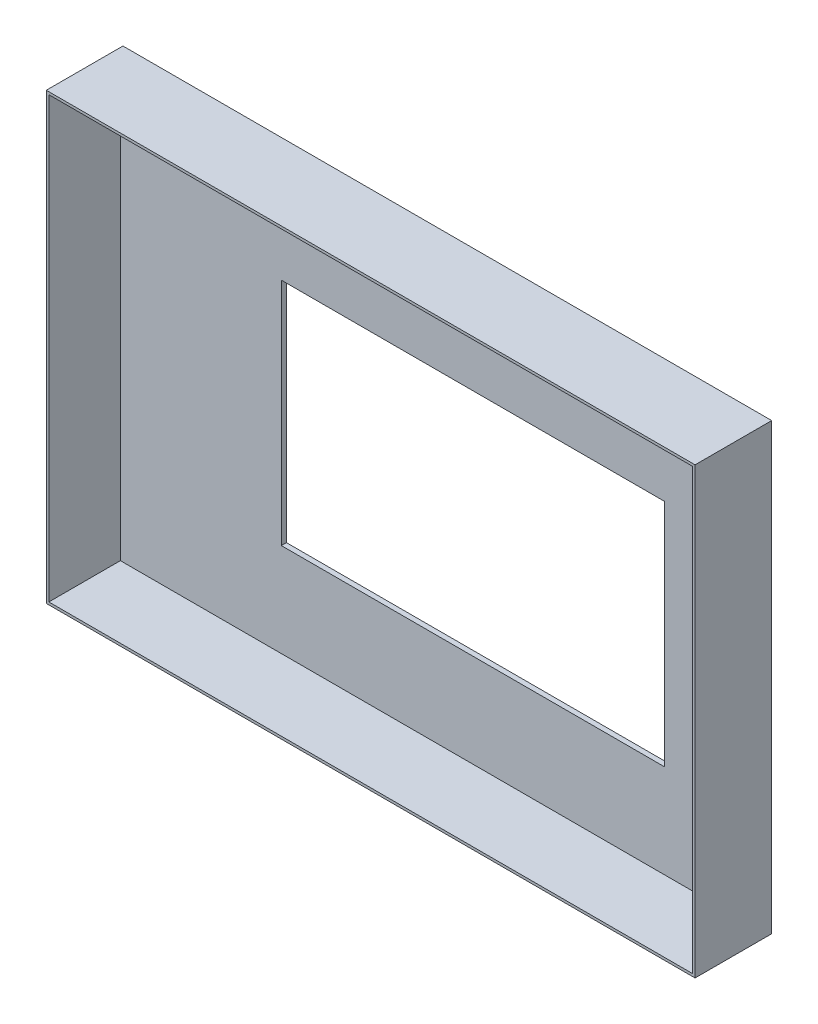
ISO-10303-21;
HEADER;
FILE_DESCRIPTION(('STEP AP214'),'2;1');
FILE_NAME('part.step','',(''),(''),'','','');
FILE_SCHEMA(('AUTOMOTIVE_DESIGN { 1 0 10303 214 1 1 1 1 }'));
ENDSEC;
DATA;
#1=APPLICATION_CONTEXT('core data for automotive mechanical design processes');
#2=APPLICATION_PROTOCOL_DEFINITION('international standard','automotive_design',2000,#1);
#3=PRODUCT_CONTEXT('',#1,'mechanical');
#4=PRODUCT('Part','Part','',(#3));
#5=PRODUCT_RELATED_PRODUCT_CATEGORY('part','',(#4));
#6=PRODUCT_DEFINITION_FORMATION('','',#4);
#7=PRODUCT_DEFINITION_CONTEXT('part definition',#1,'design');
#8=PRODUCT_DEFINITION('design','',#6,#7);
#9=PRODUCT_DEFINITION_SHAPE('','',#8);
#10=(LENGTH_UNIT() NAMED_UNIT(*) SI_UNIT(.MILLI.,.METRE.));
#11=(NAMED_UNIT(*) PLANE_ANGLE_UNIT() SI_UNIT($,.RADIAN.));
#12=(NAMED_UNIT(*) SI_UNIT($,.STERADIAN.) SOLID_ANGLE_UNIT());
#13=UNCERTAINTY_MEASURE_WITH_UNIT(LENGTH_MEASURE(1.E-05),#10,'distance_accuracy_value','');
#14=(GEOMETRIC_REPRESENTATION_CONTEXT(3) GLOBAL_UNCERTAINTY_ASSIGNED_CONTEXT((#13)) GLOBAL_UNIT_ASSIGNED_CONTEXT((#10,
#11,#12)) REPRESENTATION_CONTEXT('',''));
#15=CARTESIAN_POINT('',(0.,0.,0.));
#16=DIRECTION('',(0.,0.,1.));
#17=DIRECTION('',(1.,0.,0.));
#18=AXIS2_PLACEMENT_3D('',#15,#16,#17);
#19=CARTESIAN_POINT('',(0.,0.,0.999999999999999));
#20=DIRECTION('',(0.,0.,1.));
#21=DIRECTION('',(1.,0.,0.));
#22=AXIS2_PLACEMENT_3D('',#19,#20,#21);
#23=PLANE('',#22);
#24=DIRECTION('',(0.,-1.,0.));
#25=VECTOR('',#24,1.);
#26=CARTESIAN_POINT('',(-61.095,26.805,0.999999999999999));
#27=LINE('',#26,#25);
#28=CARTESIAN_POINT('',(-61.095,26.805,0.999999999999999));
#29=VERTEX_POINT('',#28);
#30=CARTESIAN_POINT('',(-61.095,-59.195,0.999999999999999));
#31=VERTEX_POINT('',#30);
#32=EDGE_CURVE('E163',#29,#31,#27,.T.);
#33=ORIENTED_EDGE('',*,*,#32,.T.);
#34=DIRECTION('',(1.,0.,0.));
#35=VECTOR('',#34,1.);
#36=CARTESIAN_POINT('',(-61.095,-59.195,0.999999999999999));
#37=LINE('',#36,#35);
#38=CARTESIAN_POINT('',(64.905,-59.195,0.999999999999999));
#39=VERTEX_POINT('',#38);
#40=EDGE_CURVE('E166',#31,#39,#37,.T.);
#41=ORIENTED_EDGE('',*,*,#40,.T.);
#42=DIRECTION('',(0.,1.,0.));
#43=VECTOR('',#42,1.);
#44=CARTESIAN_POINT('',(64.905,26.805,0.999999999999999));
#45=LINE('',#44,#43);
#46=CARTESIAN_POINT('',(64.905,26.805,0.999999999999999));
#47=VERTEX_POINT('',#46);
#48=EDGE_CURVE('E170',#39,#47,#45,.T.);
#49=ORIENTED_EDGE('',*,*,#48,.T.);
#50=DIRECTION('',(-1.,0.,0.));
#51=VECTOR('',#50,1.);
#52=CARTESIAN_POINT('',(-61.095,26.805,0.999999999999999));
#53=LINE('',#52,#51);
#54=EDGE_CURVE('E173',#47,#29,#53,.T.);
#55=ORIENTED_EDGE('',*,*,#54,.T.);
#56=EDGE_LOOP('',(#33,#41,#49,#55));
#57=FACE_BOUND('',#56,.T.);
#58=DIRECTION('',(1.,0.,0.));
#59=VECTOR('',#58,1.);
#60=CARTESIAN_POINT('',(45.405,4.11652592288495,1.));
#61=LINE('',#60,#59);
#62=CARTESIAN_POINT('',(-29.595,4.11652592288495,1.));
#63=VERTEX_POINT('',#62);
#64=CARTESIAN_POINT('',(45.405,4.11652592288495,1.));
#65=VERTEX_POINT('',#64);
#66=EDGE_CURVE('E136',#63,#65,#61,.T.);
#67=ORIENTED_EDGE('',*,*,#66,.T.);
#68=DIRECTION('',(0.,-1.,0.));
#69=VECTOR('',#68,1.);
#70=CARTESIAN_POINT('',(45.405,4.11652592288495,1.));
#71=LINE('',#70,#69);
#72=CARTESIAN_POINT('',(45.405,-40.883474077115,1.));
#73=VERTEX_POINT('',#72);
#74=EDGE_CURVE('E130',#65,#73,#71,.T.);
#75=ORIENTED_EDGE('',*,*,#74,.T.);
#76=DIRECTION('',(-1.,0.,0.));
#77=VECTOR('',#76,1.);
#78=CARTESIAN_POINT('',(45.405,-40.883474077115,1.));
#79=LINE('',#78,#77);
#80=CARTESIAN_POINT('',(-29.595,-40.883474077115,1.));
#81=VERTEX_POINT('',#80);
#82=EDGE_CURVE('E139',#73,#81,#79,.T.);
#83=ORIENTED_EDGE('',*,*,#82,.T.);
#84=DIRECTION('',(0.,1.,0.));
#85=VECTOR('',#84,1.);
#86=CARTESIAN_POINT('',(-29.595,4.11652592288495,1.));
#87=LINE('',#86,#85);
#88=EDGE_CURVE('E54',#81,#63,#87,.T.);
#89=ORIENTED_EDGE('',*,*,#88,.T.);
#90=EDGE_LOOP('',(#67,#75,#83,#89));
#91=FACE_BOUND('',#90,.T.);
#92=ADVANCED_FACE('F39',(#57,#91),#23,.T.);
#93=CARTESIAN_POINT('',(-61.595,27.305,15.));
#94=DIRECTION('',(1.,0.,0.));
#95=DIRECTION('',(0.,1.,0.));
#96=AXIS2_PLACEMENT_3D('',#93,#94,#95);
#97=PLANE('',#96);
#98=DIRECTION('',(0.,-1.,0.));
#99=VECTOR('',#98,1.);
#100=CARTESIAN_POINT('',(-61.595,27.305,0.));
#101=LINE('',#100,#99);
#102=CARTESIAN_POINT('',(-61.595,27.305,0.));
#103=VERTEX_POINT('',#102);
#104=CARTESIAN_POINT('',(-61.595,-59.695,0.));
#105=VERTEX_POINT('',#104);
#106=EDGE_CURVE('E188',#103,#105,#101,.T.);
#107=ORIENTED_EDGE('',*,*,#106,.T.);
#108=DIRECTION('',(0.,0.,-1.));
#109=VECTOR('',#108,1.);
#110=CARTESIAN_POINT('',(-61.595,-59.695,15.));
#111=LINE('',#110,#109);
#112=CARTESIAN_POINT('',(-61.595,-59.695,15.));
#113=VERTEX_POINT('',#112);
#114=EDGE_CURVE('E11',#113,#105,#111,.T.);
#115=ORIENTED_EDGE('',*,*,#114,.F.);
#116=DIRECTION('',(0.,-1.,0.));
#117=VECTOR('',#116,1.);
#118=CARTESIAN_POINT('',(-61.595,27.305,15.));
#119=LINE('',#118,#117);
#120=CARTESIAN_POINT('',(-61.595,27.305,15.));
#121=VERTEX_POINT('',#120);
#122=EDGE_CURVE('E195',#121,#113,#119,.T.);
#123=ORIENTED_EDGE('',*,*,#122,.F.);
#124=DIRECTION('',(0.,0.,-1.));
#125=VECTOR('',#124,1.);
#126=CARTESIAN_POINT('',(-61.595,27.305,15.));
#127=LINE('',#126,#125);
#128=EDGE_CURVE('E205',#121,#103,#127,.T.);
#129=ORIENTED_EDGE('',*,*,#128,.T.);
#130=EDGE_LOOP('',(#107,#115,#123,#129));
#131=FACE_BOUND('',#130,.T.);
#132=ADVANCED_FACE('F41',(#131),#97,.F.);
#133=CARTESIAN_POINT('',(-61.595,-59.695,15.));
#134=DIRECTION('',(0.,1.,0.));
#135=DIRECTION('',(0.,0.,1.));
#136=AXIS2_PLACEMENT_3D('',#133,#134,#135);
#137=PLANE('',#136);
#138=DIRECTION('',(1.,0.,0.));
#139=VECTOR('',#138,1.);
#140=CARTESIAN_POINT('',(-61.595,-59.695,0.));
#141=LINE('',#140,#139);
#142=CARTESIAN_POINT('',(65.405,-59.695,0.));
#143=VERTEX_POINT('',#142);
#144=EDGE_CURVE('E208',#105,#143,#141,.T.);
#145=ORIENTED_EDGE('',*,*,#144,.T.);
#146=DIRECTION('',(0.,0.,-1.));
#147=VECTOR('',#146,1.);
#148=CARTESIAN_POINT('',(65.405,-59.695,15.));
#149=LINE('',#148,#147);
#150=CARTESIAN_POINT('',(65.405,-59.695,15.));
#151=VERTEX_POINT('',#150);
#152=EDGE_CURVE('E47',#151,#143,#149,.T.);
#153=ORIENTED_EDGE('',*,*,#152,.F.);
#154=DIRECTION('',(1.,0.,0.));
#155=VECTOR('',#154,1.);
#156=CARTESIAN_POINT('',(-61.595,-59.695,15.));
#157=LINE('',#156,#155);
#158=EDGE_CURVE('E198',#113,#151,#157,.T.);
#159=ORIENTED_EDGE('',*,*,#158,.F.);
#160=ORIENTED_EDGE('',*,*,#114,.T.);
#161=EDGE_LOOP('',(#145,#153,#159,#160));
#162=FACE_BOUND('',#161,.T.);
#163=ADVANCED_FACE('F238',(#162),#137,.F.);
#164=CARTESIAN_POINT('',(65.405,27.305,15.));
#165=DIRECTION('',(-1.,0.,0.));
#166=DIRECTION('',(0.,-1.,0.));
#167=AXIS2_PLACEMENT_3D('',#164,#165,#166);
#168=PLANE('',#167);
#169=DIRECTION('',(0.,1.,0.));
#170=VECTOR('',#169,1.);
#171=CARTESIAN_POINT('',(65.405,27.305,0.));
#172=LINE('',#171,#170);
#173=CARTESIAN_POINT('',(65.405,27.305,0.));
#174=VERTEX_POINT('',#173);
#175=EDGE_CURVE('E210',#143,#174,#172,.T.);
#176=ORIENTED_EDGE('',*,*,#175,.T.);
#177=DIRECTION('',(0.,0.,-1.));
#178=VECTOR('',#177,1.);
#179=CARTESIAN_POINT('',(65.405,27.305,15.));
#180=LINE('',#179,#178);
#181=CARTESIAN_POINT('',(65.405,27.305,15.));
#182=VERTEX_POINT('',#181);
#183=EDGE_CURVE('E215',#182,#174,#180,.T.);
#184=ORIENTED_EDGE('',*,*,#183,.F.);
#185=DIRECTION('',(0.,1.,0.));
#186=VECTOR('',#185,1.);
#187=CARTESIAN_POINT('',(65.405,27.305,15.));
#188=LINE('',#187,#186);
#189=EDGE_CURVE('E201',#151,#182,#188,.T.);
#190=ORIENTED_EDGE('',*,*,#189,.F.);
#191=ORIENTED_EDGE('',*,*,#152,.T.);
#192=EDGE_LOOP('',(#176,#184,#190,#191));
#193=FACE_BOUND('',#192,.T.);
#194=ADVANCED_FACE('F222',(#193),#168,.F.);
#195=CARTESIAN_POINT('',(-61.595,27.305,15.));
#196=DIRECTION('',(0.,-1.,0.));
#197=DIRECTION('',(0.,0.,-1.));
#198=AXIS2_PLACEMENT_3D('',#195,#196,#197);
#199=PLANE('',#198);
#200=DIRECTION('',(-1.,0.,0.));
#201=VECTOR('',#200,1.);
#202=CARTESIAN_POINT('',(-61.595,27.305,0.));
#203=LINE('',#202,#201);
#204=EDGE_CURVE('E199',#174,#103,#203,.T.);
#205=ORIENTED_EDGE('',*,*,#204,.T.);
#206=ORIENTED_EDGE('',*,*,#128,.F.);
#207=DIRECTION('',(-1.,0.,0.));
#208=VECTOR('',#207,1.);
#209=CARTESIAN_POINT('',(-61.595,27.305,15.));
#210=LINE('',#209,#208);
#211=EDGE_CURVE('E203',#182,#121,#210,.T.);
#212=ORIENTED_EDGE('',*,*,#211,.F.);
#213=ORIENTED_EDGE('',*,*,#183,.T.);
#214=EDGE_LOOP('',(#205,#206,#212,#213));
#215=FACE_BOUND('',#214,.T.);
#216=ADVANCED_FACE('F231',(#215),#199,.F.);
#217=CARTESIAN_POINT('',(0.,0.,15.));
#218=DIRECTION('',(0.,0.,1.));
#219=DIRECTION('',(1.,0.,0.));
#220=AXIS2_PLACEMENT_3D('',#217,#218,#219);
#221=PLANE('',#220);
#222=DIRECTION('',(0.,-1.,0.));
#223=VECTOR('',#222,1.);
#224=CARTESIAN_POINT('',(-61.095,26.805,15.));
#225=LINE('',#224,#223);
#226=CARTESIAN_POINT('',(-61.095,26.805,15.));
#227=VERTEX_POINT('',#226);
#228=CARTESIAN_POINT('',(-61.095,-59.195,15.));
#229=VERTEX_POINT('',#228);
#230=EDGE_CURVE('E159',#227,#229,#225,.T.);
#231=ORIENTED_EDGE('',*,*,#230,.F.);
#232=DIRECTION('',(-1.,0.,0.));
#233=VECTOR('',#232,1.);
#234=CARTESIAN_POINT('',(-61.095,26.805,15.));
#235=LINE('',#234,#233);
#236=CARTESIAN_POINT('',(64.905,26.805,15.));
#237=VERTEX_POINT('',#236);
#238=EDGE_CURVE('E167',#237,#227,#235,.T.);
#239=ORIENTED_EDGE('',*,*,#238,.F.);
#240=DIRECTION('',(0.,1.,0.));
#241=VECTOR('',#240,1.);
#242=CARTESIAN_POINT('',(64.905,26.805,15.));
#243=LINE('',#242,#241);
#244=CARTESIAN_POINT('',(64.905,-59.195,15.));
#245=VERTEX_POINT('',#244);
#246=EDGE_CURVE('E181',#245,#237,#243,.T.);
#247=ORIENTED_EDGE('',*,*,#246,.F.);
#248=DIRECTION('',(1.,0.,0.));
#249=VECTOR('',#248,1.);
#250=CARTESIAN_POINT('',(-61.095,-59.195,15.));
#251=LINE('',#250,#249);
#252=EDGE_CURVE('E178',#229,#245,#251,.T.);
#253=ORIENTED_EDGE('',*,*,#252,.F.);
#254=EDGE_LOOP('',(#231,#239,#247,#253));
#255=FACE_BOUND('',#254,.T.);
#256=ORIENTED_EDGE('',*,*,#122,.T.);
#257=ORIENTED_EDGE('',*,*,#158,.T.);
#258=ORIENTED_EDGE('',*,*,#189,.T.);
#259=ORIENTED_EDGE('',*,*,#211,.T.);
#260=EDGE_LOOP('',(#256,#257,#258,#259));
#261=FACE_BOUND('',#260,.T.);
#262=ADVANCED_FACE('F237',(#255,#261),#221,.T.);
#263=CARTESIAN_POINT('',(0.,0.,0.));
#264=DIRECTION('',(0.,0.,1.));
#265=DIRECTION('',(1.,0.,0.));
#266=AXIS2_PLACEMENT_3D('',#263,#264,#265);
#267=PLANE('',#266);
#268=DIRECTION('',(-1.,0.,0.));
#269=VECTOR('',#268,1.);
#270=CARTESIAN_POINT('',(45.405,-40.883474077115,0.));
#271=LINE('',#270,#269);
#272=CARTESIAN_POINT('',(45.405,-40.883474077115,0.));
#273=VERTEX_POINT('',#272);
#274=CARTESIAN_POINT('',(-29.595,-40.883474077115,0.));
#275=VERTEX_POINT('',#274);
#276=EDGE_CURVE('E153',#273,#275,#271,.T.);
#277=ORIENTED_EDGE('',*,*,#276,.F.);
#278=DIRECTION('',(0.,-1.,0.));
#279=VECTOR('',#278,1.);
#280=CARTESIAN_POINT('',(45.405,4.11652592288495,0.));
#281=LINE('',#280,#279);
#282=CARTESIAN_POINT('',(45.405,4.11652592288495,0.));
#283=VERTEX_POINT('',#282);
#284=EDGE_CURVE('E62',#283,#273,#281,.T.);
#285=ORIENTED_EDGE('',*,*,#284,.F.);
#286=DIRECTION('',(1.,0.,0.));
#287=VECTOR('',#286,1.);
#288=CARTESIAN_POINT('',(45.405,4.11652592288495,0.));
#289=LINE('',#288,#287);
#290=CARTESIAN_POINT('',(-29.595,4.11652592288495,0.));
#291=VERTEX_POINT('',#290);
#292=EDGE_CURVE('E144',#291,#283,#289,.T.);
#293=ORIENTED_EDGE('',*,*,#292,.F.);
#294=DIRECTION('',(0.,1.,0.));
#295=VECTOR('',#294,1.);
#296=CARTESIAN_POINT('',(-29.595,4.11652592288495,0.));
#297=LINE('',#296,#295);
#298=EDGE_CURVE('E147',#275,#291,#297,.T.);
#299=ORIENTED_EDGE('',*,*,#298,.F.);
#300=EDGE_LOOP('',(#277,#285,#293,#299));
#301=FACE_BOUND('',#300,.T.);
#302=ORIENTED_EDGE('',*,*,#106,.F.);
#303=ORIENTED_EDGE('',*,*,#204,.F.);
#304=ORIENTED_EDGE('',*,*,#175,.F.);
#305=ORIENTED_EDGE('',*,*,#144,.F.);
#306=EDGE_LOOP('',(#302,#303,#304,#305));
#307=FACE_BOUND('',#306,.T.);
#308=ADVANCED_FACE('F228',(#301,#307),#267,.F.);
#309=CARTESIAN_POINT('',(-61.095,26.805,0.999999999999999));
#310=DIRECTION('',(-1.,0.,0.));
#311=DIRECTION('',(0.,-1.,0.));
#312=AXIS2_PLACEMENT_3D('',#309,#310,#311);
#313=PLANE('',#312);
#314=ORIENTED_EDGE('',*,*,#230,.T.);
#315=DIRECTION('',(0.,0.,1.));
#316=VECTOR('',#315,1.);
#317=CARTESIAN_POINT('',(-61.095,-59.195,0.999999999999999));
#318=LINE('',#317,#316);
#319=EDGE_CURVE('E176',#31,#229,#318,.T.);
#320=ORIENTED_EDGE('',*,*,#319,.F.);
#321=ORIENTED_EDGE('',*,*,#32,.F.);
#322=DIRECTION('',(0.,0.,1.));
#323=VECTOR('',#322,1.);
#324=CARTESIAN_POINT('',(-61.095,26.805,0.999999999999999));
#325=LINE('',#324,#323);
#326=EDGE_CURVE('E186',#29,#227,#325,.T.);
#327=ORIENTED_EDGE('',*,*,#326,.T.);
#328=EDGE_LOOP('',(#314,#320,#321,#327));
#329=FACE_BOUND('',#328,.T.);
#330=ADVANCED_FACE('F257',(#329),#313,.F.);
#331=CARTESIAN_POINT('',(-61.095,26.805,0.999999999999999));
#332=DIRECTION('',(0.,1.,0.));
#333=DIRECTION('',(0.,0.,1.));
#334=AXIS2_PLACEMENT_3D('',#331,#332,#333);
#335=PLANE('',#334);
#336=ORIENTED_EDGE('',*,*,#238,.T.);
#337=ORIENTED_EDGE('',*,*,#326,.F.);
#338=ORIENTED_EDGE('',*,*,#54,.F.);
#339=DIRECTION('',(0.,0.,1.));
#340=VECTOR('',#339,1.);
#341=CARTESIAN_POINT('',(64.905,26.805,0.999999999999999));
#342=LINE('',#341,#340);
#343=EDGE_CURVE('E189',#47,#237,#342,.T.);
#344=ORIENTED_EDGE('',*,*,#343,.T.);
#345=EDGE_LOOP('',(#336,#337,#338,#344));
#346=FACE_BOUND('',#345,.T.);
#347=ADVANCED_FACE('F253',(#346),#335,.F.);
#348=CARTESIAN_POINT('',(64.905,26.805,0.999999999999999));
#349=DIRECTION('',(1.,0.,0.));
#350=DIRECTION('',(0.,1.,0.));
#351=AXIS2_PLACEMENT_3D('',#348,#349,#350);
#352=PLANE('',#351);
#353=ORIENTED_EDGE('',*,*,#246,.T.);
#354=ORIENTED_EDGE('',*,*,#343,.F.);
#355=ORIENTED_EDGE('',*,*,#48,.F.);
#356=DIRECTION('',(0.,0.,1.));
#357=VECTOR('',#356,1.);
#358=CARTESIAN_POINT('',(64.905,-59.195,0.999999999999999));
#359=LINE('',#358,#357);
#360=EDGE_CURVE('E191',#39,#245,#359,.T.);
#361=ORIENTED_EDGE('',*,*,#360,.T.);
#362=EDGE_LOOP('',(#353,#354,#355,#361));
#363=FACE_BOUND('',#362,.T.);
#364=ADVANCED_FACE('F256',(#363),#352,.F.);
#365=CARTESIAN_POINT('',(-61.095,-59.195,0.999999999999999));
#366=DIRECTION('',(0.,-1.,0.));
#367=DIRECTION('',(0.,0.,-1.));
#368=AXIS2_PLACEMENT_3D('',#365,#366,#367);
#369=PLANE('',#368);
#370=ORIENTED_EDGE('',*,*,#252,.T.);
#371=ORIENTED_EDGE('',*,*,#360,.F.);
#372=ORIENTED_EDGE('',*,*,#40,.F.);
#373=ORIENTED_EDGE('',*,*,#319,.T.);
#374=EDGE_LOOP('',(#370,#371,#372,#373));
#375=FACE_BOUND('',#374,.T.);
#376=ADVANCED_FACE('F261',(#375),#369,.F.);
#377=CARTESIAN_POINT('',(45.405,4.11652592288495,1.));
#378=DIRECTION('',(1.,0.,0.));
#379=DIRECTION('',(0.,1.,0.));
#380=AXIS2_PLACEMENT_3D('',#377,#378,#379);
#381=PLANE('',#380);
#382=ORIENTED_EDGE('',*,*,#284,.T.);
#383=DIRECTION('',(0.,0.,-1.));
#384=VECTOR('',#383,1.);
#385=CARTESIAN_POINT('',(45.405,-40.883474077115,1.));
#386=LINE('',#385,#384);
#387=EDGE_CURVE('E126',#73,#273,#386,.T.);
#388=ORIENTED_EDGE('',*,*,#387,.F.);
#389=ORIENTED_EDGE('',*,*,#74,.F.);
#390=DIRECTION('',(0.,0.,-1.));
#391=VECTOR('',#390,1.);
#392=CARTESIAN_POINT('',(45.405,4.11652592288495,1.));
#393=LINE('',#392,#391);
#394=EDGE_CURVE('E157',#65,#283,#393,.T.);
#395=ORIENTED_EDGE('',*,*,#394,.T.);
#396=EDGE_LOOP('',(#382,#388,#389,#395));
#397=FACE_BOUND('',#396,.T.);
#398=ADVANCED_FACE('F128',(#397),#381,.F.);
#399=CARTESIAN_POINT('',(45.405,4.11652592288495,1.));
#400=DIRECTION('',(0.,1.,0.));
#401=DIRECTION('',(0.,0.,1.));
#402=AXIS2_PLACEMENT_3D('',#399,#400,#401);
#403=PLANE('',#402);
#404=ORIENTED_EDGE('',*,*,#292,.T.);
#405=ORIENTED_EDGE('',*,*,#394,.F.);
#406=ORIENTED_EDGE('',*,*,#66,.F.);
#407=DIRECTION('',(0.,0.,-1.));
#408=VECTOR('',#407,1.);
#409=CARTESIAN_POINT('',(-29.595,4.11652592288495,1.));
#410=LINE('',#409,#408);
#411=EDGE_CURVE('E160',#63,#291,#410,.T.);
#412=ORIENTED_EDGE('',*,*,#411,.T.);
#413=EDGE_LOOP('',(#404,#405,#406,#412));
#414=FACE_BOUND('',#413,.T.);
#415=ADVANCED_FACE('F310',(#414),#403,.F.);
#416=CARTESIAN_POINT('',(-29.595,4.11652592288495,1.));
#417=DIRECTION('',(-1.,0.,0.));
#418=DIRECTION('',(0.,-1.,0.));
#419=AXIS2_PLACEMENT_3D('',#416,#417,#418);
#420=PLANE('',#419);
#421=ORIENTED_EDGE('',*,*,#298,.T.);
#422=ORIENTED_EDGE('',*,*,#411,.F.);
#423=ORIENTED_EDGE('',*,*,#88,.F.);
#424=DIRECTION('',(0.,0.,-1.));
#425=VECTOR('',#424,1.);
#426=CARTESIAN_POINT('',(-29.595,-40.883474077115,1.));
#427=LINE('',#426,#425);
#428=EDGE_CURVE('E135',#81,#275,#427,.T.);
#429=ORIENTED_EDGE('',*,*,#428,.T.);
#430=EDGE_LOOP('',(#421,#422,#423,#429));
#431=FACE_BOUND('',#430,.T.);
#432=ADVANCED_FACE('F316',(#431),#420,.F.);
#433=CARTESIAN_POINT('',(45.405,-40.883474077115,1.));
#434=DIRECTION('',(0.,-1.,0.));
#435=DIRECTION('',(0.,0.,-1.));
#436=AXIS2_PLACEMENT_3D('',#433,#434,#435);
#437=PLANE('',#436);
#438=ORIENTED_EDGE('',*,*,#276,.T.);
#439=ORIENTED_EDGE('',*,*,#428,.F.);
#440=ORIENTED_EDGE('',*,*,#82,.F.);
#441=ORIENTED_EDGE('',*,*,#387,.T.);
#442=EDGE_LOOP('',(#438,#439,#440,#441));
#443=FACE_BOUND('',#442,.T.);
#444=ADVANCED_FACE('F140',(#443),#437,.F.);
#445=CLOSED_SHELL('',(#92,#132,#163,#194,#216,#262,#308,#330,#347,#364,#376,#398,#415,#432,#444));
#446=MANIFOLD_SOLID_BREP('B2',#445);
#447=ADVANCED_BREP_SHAPE_REPRESENTATION('',(#18,#446),#14);
#448=SHAPE_DEFINITION_REPRESENTATION(#9,#447);
ENDSEC;
END-ISO-10303-21;
